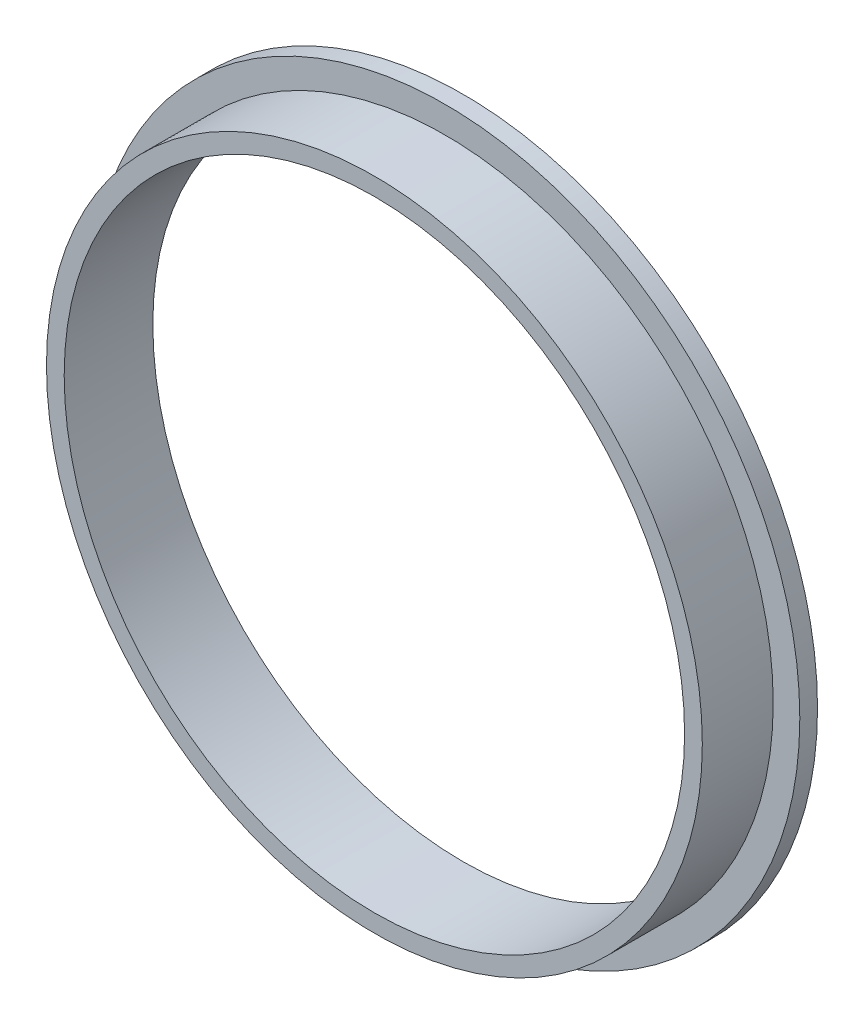
ISO-10303-21;
HEADER;
FILE_DESCRIPTION(('STEP AP214'),'2;1');
FILE_NAME('part.step','',(''),(''),'','','');
FILE_SCHEMA(('AUTOMOTIVE_DESIGN { 1 0 10303 214 1 1 1 1 }'));
ENDSEC;
DATA;
#1=APPLICATION_CONTEXT('core data for automotive mechanical design processes');
#2=APPLICATION_PROTOCOL_DEFINITION('international standard','automotive_design',2000,#1);
#3=PRODUCT_CONTEXT('',#1,'mechanical');
#4=PRODUCT('Part','Part','',(#3));
#5=PRODUCT_RELATED_PRODUCT_CATEGORY('part','',(#4));
#6=PRODUCT_DEFINITION_FORMATION('','',#4);
#7=PRODUCT_DEFINITION_CONTEXT('part definition',#1,'design');
#8=PRODUCT_DEFINITION('design','',#6,#7);
#9=PRODUCT_DEFINITION_SHAPE('','',#8);
#10=(LENGTH_UNIT() NAMED_UNIT(*) SI_UNIT(.MILLI.,.METRE.));
#11=(NAMED_UNIT(*) PLANE_ANGLE_UNIT() SI_UNIT($,.RADIAN.));
#12=(NAMED_UNIT(*) SI_UNIT($,.STERADIAN.) SOLID_ANGLE_UNIT());
#13=UNCERTAINTY_MEASURE_WITH_UNIT(LENGTH_MEASURE(1.E-05),#10,'distance_accuracy_value','');
#14=(GEOMETRIC_REPRESENTATION_CONTEXT(3) GLOBAL_UNCERTAINTY_ASSIGNED_CONTEXT((#13)) GLOBAL_UNIT_ASSIGNED_CONTEXT((#10,
#11,#12)) REPRESENTATION_CONTEXT('',''));
#15=CARTESIAN_POINT('',(0.,0.,0.));
#16=DIRECTION('',(0.,0.,1.));
#17=DIRECTION('',(1.,0.,0.));
#18=AXIS2_PLACEMENT_3D('',#15,#16,#17);
#19=CARTESIAN_POINT('',(0.,0.,10.));
#20=DIRECTION('',(0.,0.,1.));
#21=DIRECTION('',(1.,0.,0.));
#22=AXIS2_PLACEMENT_3D('',#19,#20,#21);
#23=PLANE('',#22);
#24=CARTESIAN_POINT('',(0.,0.,10.));
#25=DIRECTION('',(0.,0.,1.));
#26=DIRECTION('',(1.,0.,0.));
#27=AXIS2_PLACEMENT_3D('',#24,#25,#26);
#28=CIRCLE('',#27,37.);
#29=CARTESIAN_POINT('',(37.,0.,10.));
#30=VERTEX_POINT('',#29);
#31=EDGE_CURVE('E10',#30,#30,#28,.T.);
#32=ORIENTED_EDGE('',*,*,#31,.T.);
#33=EDGE_LOOP('',(#32));
#34=FACE_BOUND('',#33,.T.);
#35=CARTESIAN_POINT('',(0.,0.,10.));
#36=DIRECTION('',(0.,0.,1.));
#37=DIRECTION('',(1.,0.,0.));
#38=AXIS2_PLACEMENT_3D('',#35,#36,#37);
#39=CIRCLE('',#38,35.);
#40=CARTESIAN_POINT('',(35.,0.,10.));
#41=VERTEX_POINT('',#40);
#42=EDGE_CURVE('E37',#41,#41,#39,.T.);
#43=ORIENTED_EDGE('',*,*,#42,.F.);
#44=EDGE_LOOP('',(#43));
#45=FACE_BOUND('',#44,.T.);
#46=ADVANCED_FACE('F30',(#34,#45),#23,.T.);
#47=CARTESIAN_POINT('',(0.,0.,10.));
#48=DIRECTION('',(0.,0.,-1.));
#49=DIRECTION('',(-1.,0.,0.));
#50=AXIS2_PLACEMENT_3D('',#47,#48,#49);
#51=CYLINDRICAL_SURFACE('',#50,37.);
#52=CARTESIAN_POINT('',(0.,0.,2.));
#53=DIRECTION('',(0.,0.,1.));
#54=DIRECTION('',(1.,0.,0.));
#55=AXIS2_PLACEMENT_3D('',#52,#53,#54);
#56=CIRCLE('',#55,37.);
#57=CARTESIAN_POINT('',(37.,0.,2.));
#58=VERTEX_POINT('',#57);
#59=EDGE_CURVE('E41',#58,#58,#56,.T.);
#60=ORIENTED_EDGE('',*,*,#59,.T.);
#61=EDGE_LOOP('',(#60));
#62=FACE_BOUND('',#61,.T.);
#63=ORIENTED_EDGE('',*,*,#31,.F.);
#64=EDGE_LOOP('',(#63));
#65=FACE_BOUND('',#64,.T.);
#66=ADVANCED_FACE('F32',(#62,#65),#51,.T.);
#67=CARTESIAN_POINT('',(0.,0.,10.));
#68=DIRECTION('',(0.,0.,-1.));
#69=DIRECTION('',(-1.,0.,0.));
#70=AXIS2_PLACEMENT_3D('',#67,#68,#69);
#71=CYLINDRICAL_SURFACE('',#70,35.);
#72=ORIENTED_EDGE('',*,*,#42,.T.);
#73=EDGE_LOOP('',(#72));
#74=FACE_BOUND('',#73,.T.);
#75=CARTESIAN_POINT('',(0.,0.,0.));
#76=DIRECTION('',(0.,0.,1.));
#77=DIRECTION('',(1.,0.,0.));
#78=AXIS2_PLACEMENT_3D('',#75,#76,#77);
#79=CIRCLE('',#78,35.);
#80=CARTESIAN_POINT('',(35.,0.,0.));
#81=VERTEX_POINT('',#80);
#82=EDGE_CURVE('E51',#81,#81,#79,.T.);
#83=ORIENTED_EDGE('',*,*,#82,.F.);
#84=EDGE_LOOP('',(#83));
#85=FACE_BOUND('',#84,.T.);
#86=ADVANCED_FACE('F60',(#74,#85),#71,.F.);
#87=CARTESIAN_POINT('',(0.,0.,2.));
#88=DIRECTION('',(0.,0.,-1.));
#89=DIRECTION('',(-1.,0.,0.));
#90=AXIS2_PLACEMENT_3D('',#87,#88,#89);
#91=CYLINDRICAL_SURFACE('',#90,40.);
#92=CARTESIAN_POINT('',(0.,0.,2.));
#93=DIRECTION('',(0.,0.,1.));
#94=DIRECTION('',(1.,0.,0.));
#95=AXIS2_PLACEMENT_3D('',#92,#93,#94);
#96=CIRCLE('',#95,40.);
#97=CARTESIAN_POINT('',(40.,0.,2.));
#98=VERTEX_POINT('',#97);
#99=EDGE_CURVE('E45',#98,#98,#96,.T.);
#100=ORIENTED_EDGE('',*,*,#99,.F.);
#101=EDGE_LOOP('',(#100));
#102=FACE_BOUND('',#101,.T.);
#103=CARTESIAN_POINT('',(0.,0.,0.));
#104=DIRECTION('',(0.,0.,1.));
#105=DIRECTION('',(1.,0.,0.));
#106=AXIS2_PLACEMENT_3D('',#103,#104,#105);
#107=CIRCLE('',#106,40.);
#108=CARTESIAN_POINT('',(40.,0.,0.));
#109=VERTEX_POINT('',#108);
#110=EDGE_CURVE('E48',#109,#109,#107,.T.);
#111=ORIENTED_EDGE('',*,*,#110,.T.);
#112=EDGE_LOOP('',(#111));
#113=FACE_BOUND('',#112,.T.);
#114=ADVANCED_FACE('F62',(#102,#113),#91,.T.);
#115=CARTESIAN_POINT('',(0.,0.,2.));
#116=DIRECTION('',(0.,0.,1.));
#117=DIRECTION('',(1.,0.,0.));
#118=AXIS2_PLACEMENT_3D('',#115,#116,#117);
#119=PLANE('',#118);
#120=ORIENTED_EDGE('',*,*,#59,.F.);
#121=EDGE_LOOP('',(#120));
#122=FACE_BOUND('',#121,.T.);
#123=ORIENTED_EDGE('',*,*,#99,.T.);
#124=EDGE_LOOP('',(#123));
#125=FACE_BOUND('',#124,.T.);
#126=ADVANCED_FACE('F68',(#122,#125),#119,.T.);
#127=CARTESIAN_POINT('',(0.,0.,0.));
#128=DIRECTION('',(0.,0.,1.));
#129=DIRECTION('',(1.,0.,0.));
#130=AXIS2_PLACEMENT_3D('',#127,#128,#129);
#131=PLANE('',#130);
#132=ORIENTED_EDGE('',*,*,#82,.T.);
#133=EDGE_LOOP('',(#132));
#134=FACE_BOUND('',#133,.T.);
#135=ORIENTED_EDGE('',*,*,#110,.F.);
#136=EDGE_LOOP('',(#135));
#137=FACE_BOUND('',#136,.T.);
#138=ADVANCED_FACE('F57',(#134,#137),#131,.F.);
#139=CLOSED_SHELL('',(#46,#66,#86,#114,#126,#138));
#140=MANIFOLD_SOLID_BREP('B2',#139);
#141=ADVANCED_BREP_SHAPE_REPRESENTATION('',(#18,#140),#14);
#142=SHAPE_DEFINITION_REPRESENTATION(#9,#141);
ENDSEC;
END-ISO-10303-21;
